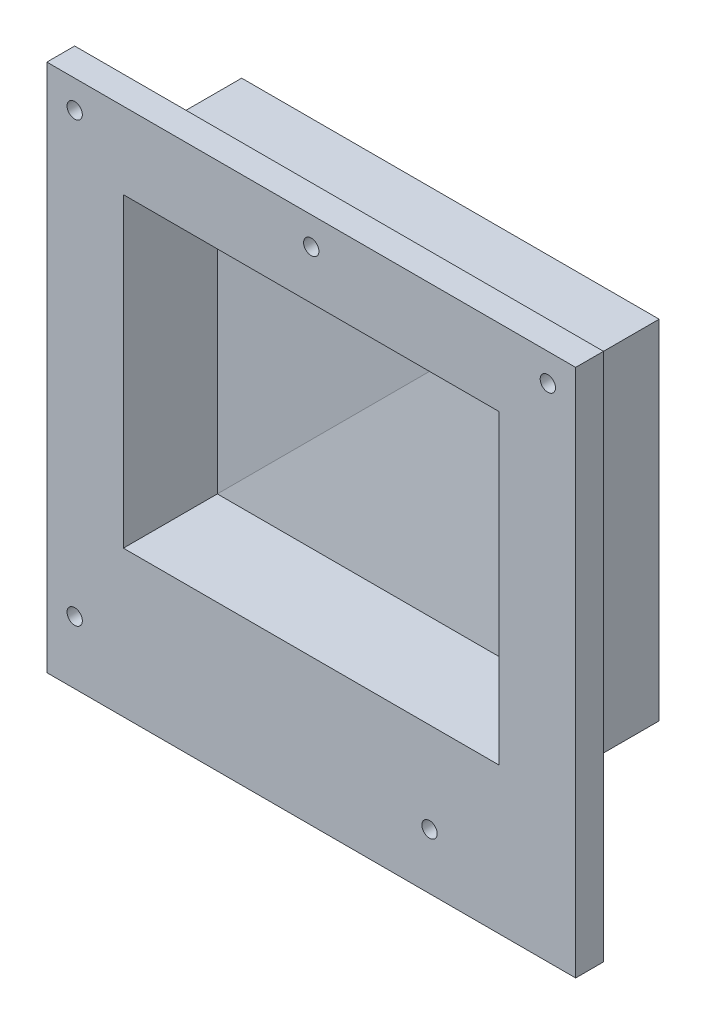
ISO-10303-21;
HEADER;
FILE_DESCRIPTION(('STEP AP214'),'2;1');
FILE_NAME('part.step','',(''),(''),'','','');
FILE_SCHEMA(('AUTOMOTIVE_DESIGN { 1 0 10303 214 1 1 1 1 }'));
ENDSEC;
DATA;
#1=APPLICATION_CONTEXT('core data for automotive mechanical design processes');
#2=APPLICATION_PROTOCOL_DEFINITION('international standard','automotive_design',2000,#1);
#3=PRODUCT_CONTEXT('',#1,'mechanical');
#4=PRODUCT('Part','Part','',(#3));
#5=PRODUCT_RELATED_PRODUCT_CATEGORY('part','',(#4));
#6=PRODUCT_DEFINITION_FORMATION('','',#4);
#7=PRODUCT_DEFINITION_CONTEXT('part definition',#1,'design');
#8=PRODUCT_DEFINITION('design','',#6,#7);
#9=PRODUCT_DEFINITION_SHAPE('','',#8);
#10=(LENGTH_UNIT() NAMED_UNIT(*) SI_UNIT(.MILLI.,.METRE.));
#11=(NAMED_UNIT(*) PLANE_ANGLE_UNIT() SI_UNIT($,.RADIAN.));
#12=(NAMED_UNIT(*) SI_UNIT($,.STERADIAN.) SOLID_ANGLE_UNIT());
#13=UNCERTAINTY_MEASURE_WITH_UNIT(LENGTH_MEASURE(1.E-05),#10,'distance_accuracy_value','');
#14=(GEOMETRIC_REPRESENTATION_CONTEXT(3) GLOBAL_UNCERTAINTY_ASSIGNED_CONTEXT((#13)) GLOBAL_UNIT_ASSIGNED_CONTEXT((#10,
#11,#12)) REPRESENTATION_CONTEXT('',''));
#15=CARTESIAN_POINT('',(0.,0.,0.));
#16=DIRECTION('',(0.,0.,1.));
#17=DIRECTION('',(1.,0.,0.));
#18=AXIS2_PLACEMENT_3D('',#15,#16,#17);
#19=CARTESIAN_POINT('',(0.,0.,10.));
#20=DIRECTION('',(0.,-1.,0.));
#21=DIRECTION('',(0.,0.,-1.));
#22=AXIS2_PLACEMENT_3D('',#19,#20,#21);
#23=PLANE('',#22);
#24=DIRECTION('',(-1.,0.,0.));
#25=VECTOR('',#24,1.);
#26=CARTESIAN_POINT('',(0.,0.,0.));
#27=LINE('',#26,#25);
#28=CARTESIAN_POINT('',(477.5,0.,0.));
#29=VERTEX_POINT('',#28);
#30=CARTESIAN_POINT('',(287.5,0.,0.));
#31=VERTEX_POINT('',#30);
#32=EDGE_CURVE('E214',#29,#31,#27,.T.);
#33=ORIENTED_EDGE('',*,*,#32,.F.);
#34=DIRECTION('',(0.,0.,-1.));
#35=VECTOR('',#34,1.);
#36=CARTESIAN_POINT('',(477.5,0.,10.));
#37=LINE('',#36,#35);
#38=CARTESIAN_POINT('',(477.5,0.,10.));
#39=VERTEX_POINT('',#38);
#40=EDGE_CURVE('E245',#39,#29,#37,.T.);
#41=ORIENTED_EDGE('',*,*,#40,.F.);
#42=DIRECTION('',(-1.,0.,0.));
#43=VECTOR('',#42,1.);
#44=CARTESIAN_POINT('',(0.,0.,10.));
#45=LINE('',#44,#43);
#46=CARTESIAN_POINT('',(287.5,0.,10.));
#47=VERTEX_POINT('',#46);
#48=EDGE_CURVE('E174',#39,#47,#45,.T.);
#49=ORIENTED_EDGE('',*,*,#48,.T.);
#50=DIRECTION('',(0.,0.,-1.));
#51=VECTOR('',#50,1.);
#52=CARTESIAN_POINT('',(287.5,0.,10.));
#53=LINE('',#52,#51);
#54=EDGE_CURVE('E202',#47,#31,#53,.T.);
#55=ORIENTED_EDGE('',*,*,#54,.T.);
#56=EDGE_LOOP('',(#33,#41,#49,#55));
#57=FACE_BOUND('',#56,.T.);
#58=ADVANCED_FACE('F36',(#57),#23,.T.);
#59=CARTESIAN_POINT('',(477.5,1.39508287962766E-13,10.));
#60=DIRECTION('',(1.,0.,0.));
#61=DIRECTION('',(0.,1.,0.));
#62=AXIS2_PLACEMENT_3D('',#59,#60,#61);
#63=PLANE('',#62);
#64=DIRECTION('',(0.,-1.,0.));
#65=VECTOR('',#64,1.);
#66=CARTESIAN_POINT('',(477.5,1.39508287962766E-13,0.));
#67=LINE('',#66,#65);
#68=CARTESIAN_POINT('',(477.5,190.,0.));
#69=VERTEX_POINT('',#68);
#70=EDGE_CURVE('E217',#69,#29,#67,.T.);
#71=ORIENTED_EDGE('',*,*,#70,.F.);
#72=DIRECTION('',(0.,0.,-1.));
#73=VECTOR('',#72,1.);
#74=CARTESIAN_POINT('',(477.5,190.,10.));
#75=LINE('',#74,#73);
#76=CARTESIAN_POINT('',(477.5,190.,10.));
#77=VERTEX_POINT('',#76);
#78=EDGE_CURVE('E243',#77,#69,#75,.T.);
#79=ORIENTED_EDGE('',*,*,#78,.F.);
#80=DIRECTION('',(0.,-1.,0.));
#81=VECTOR('',#80,1.);
#82=CARTESIAN_POINT('',(477.5,1.39508287962766E-13,10.));
#83=LINE('',#82,#81);
#84=EDGE_CURVE('E177',#77,#39,#83,.T.);
#85=ORIENTED_EDGE('',*,*,#84,.T.);
#86=ORIENTED_EDGE('',*,*,#40,.T.);
#87=EDGE_LOOP('',(#71,#79,#85,#86));
#88=FACE_BOUND('',#87,.T.);
#89=ADVANCED_FACE('F291',(#88),#63,.T.);
#90=CARTESIAN_POINT('',(0.,190.,10.));
#91=DIRECTION('',(0.,1.,0.));
#92=DIRECTION('',(0.,0.,1.));
#93=AXIS2_PLACEMENT_3D('',#90,#91,#92);
#94=PLANE('',#93);
#95=DIRECTION('',(1.,0.,0.));
#96=VECTOR('',#95,1.);
#97=CARTESIAN_POINT('',(0.,190.,0.));
#98=LINE('',#97,#96);
#99=CARTESIAN_POINT('',(287.5,190.,0.));
#100=VERTEX_POINT('',#99);
#101=EDGE_CURVE('E220',#100,#69,#98,.T.);
#102=ORIENTED_EDGE('',*,*,#101,.F.);
#103=DIRECTION('',(0.,0.,-1.));
#104=VECTOR('',#103,1.);
#105=CARTESIAN_POINT('',(287.5,190.,10.));
#106=LINE('',#105,#104);
#107=CARTESIAN_POINT('',(287.5,190.,10.));
#108=VERTEX_POINT('',#107);
#109=EDGE_CURVE('E241',#108,#100,#106,.T.);
#110=ORIENTED_EDGE('',*,*,#109,.F.);
#111=DIRECTION('',(1.,0.,0.));
#112=VECTOR('',#111,1.);
#113=CARTESIAN_POINT('',(0.,190.,10.));
#114=LINE('',#113,#112);
#115=EDGE_CURVE('E181',#108,#77,#114,.T.);
#116=ORIENTED_EDGE('',*,*,#115,.T.);
#117=ORIENTED_EDGE('',*,*,#78,.T.);
#118=EDGE_LOOP('',(#102,#110,#116,#117));
#119=FACE_BOUND('',#118,.T.);
#120=ADVANCED_FACE('F297',(#119),#94,.T.);
#121=CARTESIAN_POINT('',(467.5,180.,10.));
#122=DIRECTION('',(0.,0.,-1.));
#123=DIRECTION('',(-1.,0.,0.));
#124=AXIS2_PLACEMENT_3D('',#121,#122,#123);
#125=CYLINDRICAL_SURFACE('',#124,2.75000000000004);
#126=CARTESIAN_POINT('',(467.5,180.,10.));
#127=DIRECTION('',(0.,0.,1.));
#128=DIRECTION('',(1.,0.,0.));
#129=AXIS2_PLACEMENT_3D('',#126,#127,#128);
#130=CIRCLE('',#129,2.75000000000004);
#131=CARTESIAN_POINT('',(470.25,180.,10.));
#132=VERTEX_POINT('',#131);
#133=EDGE_CURVE('E196',#132,#132,#130,.F.);
#134=ORIENTED_EDGE('',*,*,#133,.F.);
#135=EDGE_LOOP('',(#134));
#136=FACE_BOUND('',#135,.T.);
#137=CARTESIAN_POINT('',(467.5,180.,0.));
#138=DIRECTION('',(0.,0.,1.));
#139=DIRECTION('',(1.,0.,0.));
#140=AXIS2_PLACEMENT_3D('',#137,#138,#139);
#141=CIRCLE('',#140,2.75000000000004);
#142=CARTESIAN_POINT('',(470.25,180.,0.));
#143=VERTEX_POINT('',#142);
#144=EDGE_CURVE('E235',#143,#143,#141,.F.);
#145=ORIENTED_EDGE('',*,*,#144,.T.);
#146=EDGE_LOOP('',(#145));
#147=FACE_BOUND('',#146,.T.);
#148=ADVANCED_FACE('F309',(#136,#147),#125,.F.);
#149=CARTESIAN_POINT('',(297.5,22.5,10.));
#150=DIRECTION('',(0.,0.,-1.));
#151=DIRECTION('',(-1.,0.,0.));
#152=AXIS2_PLACEMENT_3D('',#149,#150,#151);
#153=CYLINDRICAL_SURFACE('',#152,2.75000000000004);
#154=CARTESIAN_POINT('',(297.5,22.5,10.));
#155=DIRECTION('',(0.,0.,1.));
#156=DIRECTION('',(1.,0.,0.));
#157=AXIS2_PLACEMENT_3D('',#154,#155,#156);
#158=CIRCLE('',#157,2.75000000000004);
#159=CARTESIAN_POINT('',(300.25,22.5,10.));
#160=VERTEX_POINT('',#159);
#161=EDGE_CURVE('E193',#160,#160,#158,.F.);
#162=ORIENTED_EDGE('',*,*,#161,.F.);
#163=EDGE_LOOP('',(#162));
#164=FACE_BOUND('',#163,.T.);
#165=CARTESIAN_POINT('',(297.5,22.5,0.));
#166=DIRECTION('',(0.,0.,1.));
#167=DIRECTION('',(1.,0.,0.));
#168=AXIS2_PLACEMENT_3D('',#165,#166,#167);
#169=CIRCLE('',#168,2.75000000000004);
#170=CARTESIAN_POINT('',(300.25,22.5,0.));
#171=VERTEX_POINT('',#170);
#172=EDGE_CURVE('E232',#171,#171,#169,.F.);
#173=ORIENTED_EDGE('',*,*,#172,.T.);
#174=EDGE_LOOP('',(#173));
#175=FACE_BOUND('',#174,.T.);
#176=ADVANCED_FACE('F323',(#164,#175),#153,.F.);
#177=CARTESIAN_POINT('',(382.5,180.,10.));
#178=DIRECTION('',(0.,0.,-1.));
#179=DIRECTION('',(-1.,0.,0.));
#180=AXIS2_PLACEMENT_3D('',#177,#178,#179);
#181=CYLINDRICAL_SURFACE('',#180,2.74999999999998);
#182=CARTESIAN_POINT('',(382.5,180.,10.));
#183=DIRECTION('',(0.,0.,1.));
#184=DIRECTION('',(1.,0.,0.));
#185=AXIS2_PLACEMENT_3D('',#182,#183,#184);
#186=CIRCLE('',#185,2.74999999999998);
#187=CARTESIAN_POINT('',(385.25,180.,10.));
#188=VERTEX_POINT('',#187);
#189=EDGE_CURVE('E190',#188,#188,#186,.F.);
#190=ORIENTED_EDGE('',*,*,#189,.F.);
#191=EDGE_LOOP('',(#190));
#192=FACE_BOUND('',#191,.T.);
#193=CARTESIAN_POINT('',(382.5,180.,0.));
#194=DIRECTION('',(0.,0.,1.));
#195=DIRECTION('',(1.,0.,0.));
#196=AXIS2_PLACEMENT_3D('',#193,#194,#195);
#197=CIRCLE('',#196,2.74999999999998);
#198=CARTESIAN_POINT('',(385.25,180.,0.));
#199=VERTEX_POINT('',#198);
#200=EDGE_CURVE('E229',#199,#199,#197,.F.);
#201=ORIENTED_EDGE('',*,*,#200,.T.);
#202=EDGE_LOOP('',(#201));
#203=FACE_BOUND('',#202,.T.);
#204=ADVANCED_FACE('F319',(#192,#203),#181,.F.);
#205=CARTESIAN_POINT('',(425.,20.,10.));
#206=DIRECTION('',(0.,0.,-1.));
#207=DIRECTION('',(-1.,0.,0.));
#208=AXIS2_PLACEMENT_3D('',#205,#206,#207);
#209=CYLINDRICAL_SURFACE('',#208,2.75000000000004);
#210=CARTESIAN_POINT('',(425.,20.,10.));
#211=DIRECTION('',(0.,0.,1.));
#212=DIRECTION('',(1.,0.,0.));
#213=AXIS2_PLACEMENT_3D('',#210,#211,#212);
#214=CIRCLE('',#213,2.75000000000004);
#215=CARTESIAN_POINT('',(427.75,20.,10.));
#216=VERTEX_POINT('',#215);
#217=EDGE_CURVE('E187',#216,#216,#214,.F.);
#218=ORIENTED_EDGE('',*,*,#217,.F.);
#219=EDGE_LOOP('',(#218));
#220=FACE_BOUND('',#219,.T.);
#221=CARTESIAN_POINT('',(425.,20.,0.));
#222=DIRECTION('',(0.,0.,1.));
#223=DIRECTION('',(1.,0.,0.));
#224=AXIS2_PLACEMENT_3D('',#221,#222,#223);
#225=CIRCLE('',#224,2.75000000000004);
#226=CARTESIAN_POINT('',(427.75,20.,0.));
#227=VERTEX_POINT('',#226);
#228=EDGE_CURVE('E226',#227,#227,#225,.F.);
#229=ORIENTED_EDGE('',*,*,#228,.T.);
#230=EDGE_LOOP('',(#229));
#231=FACE_BOUND('',#230,.T.);
#232=ADVANCED_FACE('F315',(#220,#231),#209,.F.);
#233=CARTESIAN_POINT('',(287.5,0.,10.));
#234=DIRECTION('',(-1.,0.,0.));
#235=DIRECTION('',(0.,0.,1.));
#236=AXIS2_PLACEMENT_3D('',#233,#234,#235);
#237=PLANE('',#236);
#238=DIRECTION('',(0.,1.,0.));
#239=VECTOR('',#238,1.);
#240=CARTESIAN_POINT('',(287.5,0.,0.));
#241=LINE('',#240,#239);
#242=EDGE_CURVE('E223',#31,#100,#241,.T.);
#243=ORIENTED_EDGE('',*,*,#242,.F.);
#244=ORIENTED_EDGE('',*,*,#54,.F.);
#245=DIRECTION('',(0.,1.,0.));
#246=VECTOR('',#245,1.);
#247=CARTESIAN_POINT('',(287.5,0.,10.));
#248=LINE('',#247,#246);
#249=EDGE_CURVE('E184',#47,#108,#248,.T.);
#250=ORIENTED_EDGE('',*,*,#249,.T.);
#251=ORIENTED_EDGE('',*,*,#109,.T.);
#252=EDGE_LOOP('',(#243,#244,#250,#251));
#253=FACE_BOUND('',#252,.T.);
#254=ADVANCED_FACE('F311',(#253),#237,.T.);
#255=CARTESIAN_POINT('',(297.5,180.,10.));
#256=DIRECTION('',(0.,0.,-1.));
#257=DIRECTION('',(-1.,0.,0.));
#258=AXIS2_PLACEMENT_3D('',#255,#256,#257);
#259=CYLINDRICAL_SURFACE('',#258,2.74999999999998);
#260=CARTESIAN_POINT('',(297.5,180.,10.));
#261=DIRECTION('',(0.,0.,1.));
#262=DIRECTION('',(1.,0.,0.));
#263=AXIS2_PLACEMENT_3D('',#260,#261,#262);
#264=CIRCLE('',#263,2.74999999999998);
#265=CARTESIAN_POINT('',(300.25,180.,10.));
#266=VERTEX_POINT('',#265);
#267=EDGE_CURVE('E199',#266,#266,#264,.F.);
#268=ORIENTED_EDGE('',*,*,#267,.F.);
#269=EDGE_LOOP('',(#268));
#270=FACE_BOUND('',#269,.T.);
#271=CARTESIAN_POINT('',(297.5,180.,0.));
#272=DIRECTION('',(0.,0.,1.));
#273=DIRECTION('',(1.,0.,0.));
#274=AXIS2_PLACEMENT_3D('',#271,#272,#273);
#275=CIRCLE('',#274,2.74999999999998);
#276=CARTESIAN_POINT('',(300.25,180.,0.));
#277=VERTEX_POINT('',#276);
#278=EDGE_CURVE('E178',#277,#277,#275,.F.);
#279=ORIENTED_EDGE('',*,*,#278,.T.);
#280=EDGE_LOOP('',(#279));
#281=FACE_BOUND('',#280,.T.);
#282=ADVANCED_FACE('F314',(#270,#281),#259,.F.);
#283=CARTESIAN_POINT('',(0.,0.,10.));
#284=DIRECTION('',(0.,0.,1.));
#285=DIRECTION('',(1.,0.,0.));
#286=AXIS2_PLACEMENT_3D('',#283,#284,#285);
#287=PLANE('',#286);
#288=ORIENTED_EDGE('',*,*,#48,.F.);
#289=ORIENTED_EDGE('',*,*,#84,.F.);
#290=ORIENTED_EDGE('',*,*,#115,.F.);
#291=ORIENTED_EDGE('',*,*,#249,.F.);
#292=EDGE_LOOP('',(#288,#289,#290,#291));
#293=FACE_BOUND('',#292,.T.);
#294=ORIENTED_EDGE('',*,*,#217,.T.);
#295=EDGE_LOOP('',(#294));
#296=FACE_BOUND('',#295,.T.);
#297=ORIENTED_EDGE('',*,*,#189,.T.);
#298=EDGE_LOOP('',(#297));
#299=FACE_BOUND('',#298,.T.);
#300=ORIENTED_EDGE('',*,*,#161,.T.);
#301=EDGE_LOOP('',(#300));
#302=FACE_BOUND('',#301,.T.);
#303=ORIENTED_EDGE('',*,*,#133,.T.);
#304=EDGE_LOOP('',(#303));
#305=FACE_BOUND('',#304,.T.);
#306=ORIENTED_EDGE('',*,*,#267,.T.);
#307=EDGE_LOOP('',(#306));
#308=FACE_BOUND('',#307,.T.);
#309=DIRECTION('',(-1.,0.,0.));
#310=VECTOR('',#309,1.);
#311=CARTESIAN_POINT('',(315.,162.5,10.));
#312=LINE('',#311,#310);
#313=CARTESIAN_POINT('',(450.,162.5,10.));
#314=VERTEX_POINT('',#313);
#315=CARTESIAN_POINT('',(315.,162.5,10.));
#316=VERTEX_POINT('',#315);
#317=EDGE_CURVE('E148',#314,#316,#312,.T.);
#318=ORIENTED_EDGE('',*,*,#317,.F.);
#319=DIRECTION('',(0.,1.,0.));
#320=VECTOR('',#319,1.);
#321=CARTESIAN_POINT('',(450.,162.5,10.));
#322=LINE('',#321,#320);
#323=CARTESIAN_POINT('',(450.,52.5,10.));
#324=VERTEX_POINT('',#323);
#325=EDGE_CURVE('E152',#324,#314,#322,.T.);
#326=ORIENTED_EDGE('',*,*,#325,.F.);
#327=DIRECTION('',(1.,0.,0.));
#328=VECTOR('',#327,1.);
#329=CARTESIAN_POINT('',(315.,52.5,10.));
#330=LINE('',#329,#328);
#331=CARTESIAN_POINT('',(315.,52.5,10.));
#332=VERTEX_POINT('',#331);
#333=EDGE_CURVE('E137',#332,#324,#330,.T.);
#334=ORIENTED_EDGE('',*,*,#333,.F.);
#335=DIRECTION('',(0.,-1.,0.));
#336=VECTOR('',#335,1.);
#337=CARTESIAN_POINT('',(315.,162.5,10.));
#338=LINE('',#337,#336);
#339=EDGE_CURVE('E143',#316,#332,#338,.T.);
#340=ORIENTED_EDGE('',*,*,#339,.F.);
#341=EDGE_LOOP('',(#318,#326,#334,#340));
#342=FACE_BOUND('',#341,.T.);
#343=ADVANCED_FACE('F150',(#293,#296,#299,#302,#305,#308,#342),#287,.T.);
#344=CARTESIAN_POINT('',(0.,0.,0.));
#345=DIRECTION('',(0.,0.,1.));
#346=DIRECTION('',(1.,0.,0.));
#347=AXIS2_PLACEMENT_3D('',#344,#345,#346);
#348=PLANE('',#347);
#349=DIRECTION('',(0.,1.,0.));
#350=VECTOR('',#349,1.);
#351=CARTESIAN_POINT('',(457.5,0.,0.));
#352=LINE('',#351,#350);
#353=CARTESIAN_POINT('',(457.5,45.,0.));
#354=VERTEX_POINT('',#353);
#355=CARTESIAN_POINT('',(457.5,170.,0.));
#356=VERTEX_POINT('',#355);
#357=EDGE_CURVE('E203',#354,#356,#352,.T.);
#358=ORIENTED_EDGE('',*,*,#357,.T.);
#359=DIRECTION('',(-1.,0.,0.));
#360=VECTOR('',#359,1.);
#361=CARTESIAN_POINT('',(0.,170.,0.));
#362=LINE('',#361,#360);
#363=CARTESIAN_POINT('',(307.5,170.,0.));
#364=VERTEX_POINT('',#363);
#365=EDGE_CURVE('E212',#356,#364,#362,.T.);
#366=ORIENTED_EDGE('',*,*,#365,.T.);
#367=DIRECTION('',(0.,1.,0.));
#368=VECTOR('',#367,1.);
#369=CARTESIAN_POINT('',(307.5,0.,0.));
#370=LINE('',#369,#368);
#371=CARTESIAN_POINT('',(307.5,45.,0.));
#372=VERTEX_POINT('',#371);
#373=EDGE_CURVE('E209',#372,#364,#370,.T.);
#374=ORIENTED_EDGE('',*,*,#373,.F.);
#375=DIRECTION('',(-1.,0.,0.));
#376=VECTOR('',#375,1.);
#377=CARTESIAN_POINT('',(0.,45.,0.));
#378=LINE('',#377,#376);
#379=EDGE_CURVE('E205',#354,#372,#378,.T.);
#380=ORIENTED_EDGE('',*,*,#379,.F.);
#381=EDGE_LOOP('',(#358,#366,#374,#380));
#382=FACE_BOUND('',#381,.T.);
#383=ORIENTED_EDGE('',*,*,#32,.T.);
#384=ORIENTED_EDGE('',*,*,#242,.T.);
#385=ORIENTED_EDGE('',*,*,#101,.T.);
#386=ORIENTED_EDGE('',*,*,#70,.T.);
#387=EDGE_LOOP('',(#383,#384,#385,#386));
#388=FACE_BOUND('',#387,.T.);
#389=ORIENTED_EDGE('',*,*,#228,.F.);
#390=EDGE_LOOP('',(#389));
#391=FACE_BOUND('',#390,.T.);
#392=ORIENTED_EDGE('',*,*,#200,.F.);
#393=EDGE_LOOP('',(#392));
#394=FACE_BOUND('',#393,.T.);
#395=ORIENTED_EDGE('',*,*,#172,.F.);
#396=EDGE_LOOP('',(#395));
#397=FACE_BOUND('',#396,.T.);
#398=ORIENTED_EDGE('',*,*,#144,.F.);
#399=EDGE_LOOP('',(#398));
#400=FACE_BOUND('',#399,.T.);
#401=ORIENTED_EDGE('',*,*,#278,.F.);
#402=EDGE_LOOP('',(#401));
#403=FACE_BOUND('',#402,.T.);
#404=ADVANCED_FACE('F334',(#382,#388,#391,#394,#397,#400,#403),#348,.F.);
#405=CARTESIAN_POINT('',(307.5,45.,-235.256241897666));
#406=DIRECTION('',(0.,-1.,0.));
#407=DIRECTION('',(0.,0.,-1.));
#408=AXIS2_PLACEMENT_3D('',#405,#406,#407);
#409=PLANE('',#408);
#410=ORIENTED_EDGE('',*,*,#379,.T.);
#411=DIRECTION('',(0.,0.,1.));
#412=VECTOR('',#411,1.);
#413=CARTESIAN_POINT('',(307.5,45.,-235.256241897666));
#414=LINE('',#413,#412);
#415=CARTESIAN_POINT('',(307.5,45.,-40.));
#416=VERTEX_POINT('',#415);
#417=EDGE_CURVE('E159',#416,#372,#414,.T.);
#418=ORIENTED_EDGE('',*,*,#417,.F.);
#419=DIRECTION('',(-1.,0.,0.));
#420=VECTOR('',#419,1.);
#421=CARTESIAN_POINT('',(307.5,45.,-40.));
#422=LINE('',#421,#420);
#423=CARTESIAN_POINT('',(457.5,45.,-40.));
#424=VERTEX_POINT('',#423);
#425=EDGE_CURVE('E206',#424,#416,#422,.T.);
#426=ORIENTED_EDGE('',*,*,#425,.F.);
#427=DIRECTION('',(0.,0.,1.));
#428=VECTOR('',#427,1.);
#429=CARTESIAN_POINT('',(457.5,45.,-235.256241897666));
#430=LINE('',#429,#428);
#431=EDGE_CURVE('E169',#424,#354,#430,.T.);
#432=ORIENTED_EDGE('',*,*,#431,.T.);
#433=EDGE_LOOP('',(#410,#418,#426,#432));
#434=FACE_BOUND('',#433,.T.);
#435=ADVANCED_FACE('F337',(#434),#409,.T.);
#436=CARTESIAN_POINT('',(457.5,170.,-235.256241897666));
#437=DIRECTION('',(1.,0.,0.));
#438=DIRECTION('',(0.,0.,-1.));
#439=AXIS2_PLACEMENT_3D('',#436,#437,#438);
#440=PLANE('',#439);
#441=ORIENTED_EDGE('',*,*,#357,.F.);
#442=ORIENTED_EDGE('',*,*,#431,.F.);
#443=DIRECTION('',(0.,-1.,0.));
#444=VECTOR('',#443,1.);
#445=CARTESIAN_POINT('',(457.5,170.,-40.));
#446=LINE('',#445,#444);
#447=CARTESIAN_POINT('',(457.5,170.,-40.));
#448=VERTEX_POINT('',#447);
#449=EDGE_CURVE('E165',#448,#424,#446,.T.);
#450=ORIENTED_EDGE('',*,*,#449,.F.);
#451=DIRECTION('',(0.,0.,1.));
#452=VECTOR('',#451,1.);
#453=CARTESIAN_POINT('',(457.5,170.,-235.256241897666));
#454=LINE('',#453,#452);
#455=EDGE_CURVE('E166',#448,#356,#454,.T.);
#456=ORIENTED_EDGE('',*,*,#455,.T.);
#457=EDGE_LOOP('',(#441,#442,#450,#456));
#458=FACE_BOUND('',#457,.T.);
#459=ADVANCED_FACE('F349',(#458),#440,.T.);
#460=CARTESIAN_POINT('',(307.5,170.,-235.256241897666));
#461=DIRECTION('',(0.,1.,0.));
#462=DIRECTION('',(0.,0.,1.));
#463=AXIS2_PLACEMENT_3D('',#460,#461,#462);
#464=PLANE('',#463);
#465=ORIENTED_EDGE('',*,*,#365,.F.);
#466=ORIENTED_EDGE('',*,*,#455,.F.);
#467=DIRECTION('',(1.,0.,0.));
#468=VECTOR('',#467,1.);
#469=CARTESIAN_POINT('',(307.5,170.,-40.));
#470=LINE('',#469,#468);
#471=CARTESIAN_POINT('',(307.5,170.,-40.));
#472=VERTEX_POINT('',#471);
#473=EDGE_CURVE('E277',#472,#448,#470,.T.);
#474=ORIENTED_EDGE('',*,*,#473,.F.);
#475=DIRECTION('',(0.,0.,1.));
#476=VECTOR('',#475,1.);
#477=CARTESIAN_POINT('',(307.5,170.,-235.256241897666));
#478=LINE('',#477,#476);
#479=EDGE_CURVE('E162',#472,#364,#478,.T.);
#480=ORIENTED_EDGE('',*,*,#479,.T.);
#481=EDGE_LOOP('',(#465,#466,#474,#480));
#482=FACE_BOUND('',#481,.T.);
#483=ADVANCED_FACE('F345',(#482),#464,.T.);
#484=CARTESIAN_POINT('',(307.5,170.,-235.256241897666));
#485=DIRECTION('',(-1.,0.,0.));
#486=DIRECTION('',(0.,0.,1.));
#487=AXIS2_PLACEMENT_3D('',#484,#485,#486);
#488=PLANE('',#487);
#489=ORIENTED_EDGE('',*,*,#373,.T.);
#490=ORIENTED_EDGE('',*,*,#479,.F.);
#491=DIRECTION('',(0.,1.,0.));
#492=VECTOR('',#491,1.);
#493=CARTESIAN_POINT('',(307.5,170.,-40.));
#494=LINE('',#493,#492);
#495=EDGE_CURVE('E275',#416,#472,#494,.T.);
#496=ORIENTED_EDGE('',*,*,#495,.F.);
#497=ORIENTED_EDGE('',*,*,#417,.T.);
#498=EDGE_LOOP('',(#489,#490,#496,#497));
#499=FACE_BOUND('',#498,.T.);
#500=ADVANCED_FACE('F342',(#499),#488,.T.);
#501=CARTESIAN_POINT('',(315.,162.5,-235.256241897666));
#502=DIRECTION('',(-1.,0.,0.));
#503=DIRECTION('',(0.,0.,1.));
#504=AXIS2_PLACEMENT_3D('',#501,#502,#503);
#505=PLANE('',#504);
#506=DIRECTION('',(0.,0.,1.));
#507=VECTOR('',#506,1.);
#508=CARTESIAN_POINT('',(315.,52.5,-235.256241897666));
#509=LINE('',#508,#507);
#510=CARTESIAN_POINT('',(315.,52.5,-23.7511336474076));
#511=VERTEX_POINT('',#510);
#512=EDGE_CURVE('E133',#511,#332,#509,.T.);
#513=ORIENTED_EDGE('',*,*,#512,.F.);
#514=DIRECTION('',(0.,1.,0.));
#515=VECTOR('',#514,1.);
#516=CARTESIAN_POINT('',(315.,162.5,-23.7511336474076));
#517=LINE('',#516,#515);
#518=CARTESIAN_POINT('',(315.,162.5,-23.7511336474076));
#519=VERTEX_POINT('',#518);
#520=EDGE_CURVE('E46',#511,#519,#517,.T.);
#521=ORIENTED_EDGE('',*,*,#520,.T.);
#522=DIRECTION('',(0.,0.,1.));
#523=VECTOR('',#522,1.);
#524=CARTESIAN_POINT('',(315.,162.5,-235.256241897666));
#525=LINE('',#524,#523);
#526=EDGE_CURVE('E140',#519,#316,#525,.T.);
#527=ORIENTED_EDGE('',*,*,#526,.T.);
#528=ORIENTED_EDGE('',*,*,#339,.T.);
#529=EDGE_LOOP('',(#513,#521,#527,#528));
#530=FACE_BOUND('',#529,.T.);
#531=ADVANCED_FACE('F144',(#530),#505,.F.);
#532=CARTESIAN_POINT('',(315.,52.5,-235.256241897666));
#533=DIRECTION('',(0.,-1.,0.));
#534=DIRECTION('',(1.,0.,0.));
#535=AXIS2_PLACEMENT_3D('',#532,#533,#534);
#536=PLANE('',#535);
#537=DIRECTION('',(0.,0.,1.));
#538=VECTOR('',#537,1.);
#539=CARTESIAN_POINT('',(450.,52.5,-235.256241897666));
#540=LINE('',#539,#538);
#541=CARTESIAN_POINT('',(450.,52.5,-23.7511336474076));
#542=VERTEX_POINT('',#541);
#543=EDGE_CURVE('E139',#542,#324,#540,.T.);
#544=ORIENTED_EDGE('',*,*,#543,.F.);
#545=DIRECTION('',(-1.,0.,0.));
#546=VECTOR('',#545,1.);
#547=CARTESIAN_POINT('',(315.,52.5,-23.7511336474076));
#548=LINE('',#547,#546);
#549=EDGE_CURVE('E60',#542,#511,#548,.T.);
#550=ORIENTED_EDGE('',*,*,#549,.T.);
#551=ORIENTED_EDGE('',*,*,#512,.T.);
#552=ORIENTED_EDGE('',*,*,#333,.T.);
#553=EDGE_LOOP('',(#544,#550,#551,#552));
#554=FACE_BOUND('',#553,.T.);
#555=ADVANCED_FACE('F135',(#554),#536,.F.);
#556=CARTESIAN_POINT('',(450.,162.5,-235.256241897666));
#557=DIRECTION('',(1.,0.,0.));
#558=DIRECTION('',(0.,0.,-1.));
#559=AXIS2_PLACEMENT_3D('',#556,#557,#558);
#560=PLANE('',#559);
#561=DIRECTION('',(0.,1.,0.));
#562=VECTOR('',#561,1.);
#563=CARTESIAN_POINT('',(450.,-82.7081728298996,-32.5));
#564=LINE('',#563,#562);
#565=CARTESIAN_POINT('',(450.,152.499999999996,-32.5));
#566=VERTEX_POINT('',#565);
#567=CARTESIAN_POINT('',(450.,162.5,-32.5));
#568=VERTEX_POINT('',#567);
#569=EDGE_CURVE('E260',#566,#568,#564,.T.);
#570=ORIENTED_EDGE('',*,*,#569,.F.);
#571=DIRECTION('',(0.,-0.996194698091745,0.0871557427476617));
#572=VECTOR('',#571,1.);
#573=CARTESIAN_POINT('',(450.,152.499999999996,-32.5));
#574=LINE('',#573,#572);
#575=EDGE_CURVE('E252',#566,#542,#574,.T.);
#576=ORIENTED_EDGE('',*,*,#575,.T.);
#577=ORIENTED_EDGE('',*,*,#543,.T.);
#578=ORIENTED_EDGE('',*,*,#325,.T.);
#579=DIRECTION('',(0.,0.,1.));
#580=VECTOR('',#579,1.);
#581=CARTESIAN_POINT('',(450.,162.5,-235.256241897666));
#582=LINE('',#581,#580);
#583=EDGE_CURVE('E157',#568,#314,#582,.T.);
#584=ORIENTED_EDGE('',*,*,#583,.F.);
#585=EDGE_LOOP('',(#570,#576,#577,#578,#584));
#586=FACE_BOUND('',#585,.T.);
#587=ADVANCED_FACE('F257',(#586),#560,.F.);
#588=CARTESIAN_POINT('',(315.,162.5,-235.256241897666));
#589=DIRECTION('',(0.,1.,0.));
#590=DIRECTION('',(0.,0.,1.));
#591=AXIS2_PLACEMENT_3D('',#588,#589,#590);
#592=PLANE('',#591);
#593=ORIENTED_EDGE('',*,*,#526,.F.);
#594=DIRECTION('',(0.996194698091745,0.,-0.0871557427476617));
#595=VECTOR('',#594,1.);
#596=CARTESIAN_POINT('',(315.,162.5,-23.7511336474076));
#597=LINE('',#596,#595);
#598=CARTESIAN_POINT('',(414.999999999996,162.5,-32.5));
#599=VERTEX_POINT('',#598);
#600=EDGE_CURVE('E11',#519,#599,#597,.T.);
#601=ORIENTED_EDGE('',*,*,#600,.T.);
#602=DIRECTION('',(1.,0.,0.));
#603=VECTOR('',#602,1.);
#604=CARTESIAN_POINT('',(0.,162.5,-32.5));
#605=LINE('',#604,#603);
#606=EDGE_CURVE('E268',#599,#568,#605,.T.);
#607=ORIENTED_EDGE('',*,*,#606,.T.);
#608=ORIENTED_EDGE('',*,*,#583,.T.);
#609=ORIENTED_EDGE('',*,*,#317,.T.);
#610=EDGE_LOOP('',(#593,#601,#607,#608,#609));
#611=FACE_BOUND('',#610,.T.);
#612=ADVANCED_FACE('F280',(#611),#592,.F.);
#613=CARTESIAN_POINT('',(0.,0.,-40.));
#614=DIRECTION('',(0.,0.,1.));
#615=DIRECTION('',(1.,0.,0.));
#616=AXIS2_PLACEMENT_3D('',#613,#614,#615);
#617=PLANE('',#616);
#618=ORIENTED_EDGE('',*,*,#495,.T.);
#619=ORIENTED_EDGE('',*,*,#473,.T.);
#620=ORIENTED_EDGE('',*,*,#449,.T.);
#621=ORIENTED_EDGE('',*,*,#425,.T.);
#622=EDGE_LOOP('',(#618,#619,#620,#621));
#623=FACE_BOUND('',#622,.T.);
#624=ADVANCED_FACE('F288',(#623),#617,.F.);
#625=CARTESIAN_POINT('',(0.,-82.7081728298996,-32.5));
#626=DIRECTION('',(0.,0.,1.));
#627=DIRECTION('',(1.,0.,0.));
#628=AXIS2_PLACEMENT_3D('',#625,#626,#627);
#629=PLANE('',#628);
#630=DIRECTION('',(0.,-1.,0.));
#631=VECTOR('',#630,1.);
#632=CARTESIAN_POINT('',(414.999999999996,-82.7081728298996,-32.5));
#633=LINE('',#632,#631);
#634=CARTESIAN_POINT('',(414.999999999996,152.499999999996,-32.5));
#635=VERTEX_POINT('',#634);
#636=EDGE_CURVE('E247',#599,#635,#633,.T.);
#637=ORIENTED_EDGE('',*,*,#636,.T.);
#638=DIRECTION('',(1.,0.,0.));
#639=VECTOR('',#638,1.);
#640=CARTESIAN_POINT('',(0.,152.499999999996,-32.5));
#641=LINE('',#640,#639);
#642=EDGE_CURVE('E249',#635,#566,#641,.T.);
#643=ORIENTED_EDGE('',*,*,#642,.T.);
#644=ORIENTED_EDGE('',*,*,#569,.T.);
#645=ORIENTED_EDGE('',*,*,#606,.F.);
#646=EDGE_LOOP('',(#637,#643,#644,#645));
#647=FACE_BOUND('',#646,.T.);
#648=ADVANCED_FACE('F282',(#647),#629,.T.);
#649=CARTESIAN_POINT('',(315.,162.5,-23.7511336474076));
#650=DIRECTION('',(-0.0871557427476617,0.,-0.996194698091745));
#651=DIRECTION('',(0.,1.,0.));
#652=AXIS2_PLACEMENT_3D('',#649,#650,#651);
#653=PLANE('',#652);
#654=ORIENTED_EDGE('',*,*,#600,.F.);
#655=ORIENTED_EDGE('',*,*,#520,.F.);
#656=DIRECTION('',(0.705757556807952,0.705757556807952,-0.0617457854184516));
#657=VECTOR('',#656,1.);
#658=CARTESIAN_POINT('',(208.291102468513,-54.2088975314865,-14.4153148160527));
#659=LINE('',#658,#657);
#660=EDGE_CURVE('E41',#635,#511,#659,.F.);
#661=ORIENTED_EDGE('',*,*,#660,.F.);
#662=ORIENTED_EDGE('',*,*,#636,.F.);
#663=EDGE_LOOP('',(#654,#655,#661,#662));
#664=FACE_BOUND('',#663,.T.);
#665=ADVANCED_FACE('F39',(#664),#653,.F.);
#666=CARTESIAN_POINT('',(0.,152.499999999996,-32.5));
#667=DIRECTION('',(0.,-0.0871557427476617,-0.996194698091745));
#668=DIRECTION('',(1.,0.,0.));
#669=AXIS2_PLACEMENT_3D('',#666,#667,#668);
#670=PLANE('',#669);
#671=ORIENTED_EDGE('',*,*,#660,.T.);
#672=ORIENTED_EDGE('',*,*,#549,.F.);
#673=ORIENTED_EDGE('',*,*,#575,.F.);
#674=ORIENTED_EDGE('',*,*,#642,.F.);
#675=EDGE_LOOP('',(#671,#672,#673,#674));
#676=FACE_BOUND('',#675,.T.);
#677=ADVANCED_FACE('F264',(#676),#670,.F.);
#678=CLOSED_SHELL('',(#58,#89,#120,#148,#176,#204,#232,#254,#282,#343,#404,#435,#459,#483,#500,
#531,#555,#587,#612,#624,#648,#665,#677));
#679=MANIFOLD_SOLID_BREP('B2',#678);
#680=ADVANCED_BREP_SHAPE_REPRESENTATION('',(#18,#679),#14);
#681=SHAPE_DEFINITION_REPRESENTATION(#9,#680);
ENDSEC;
END-ISO-10303-21;
